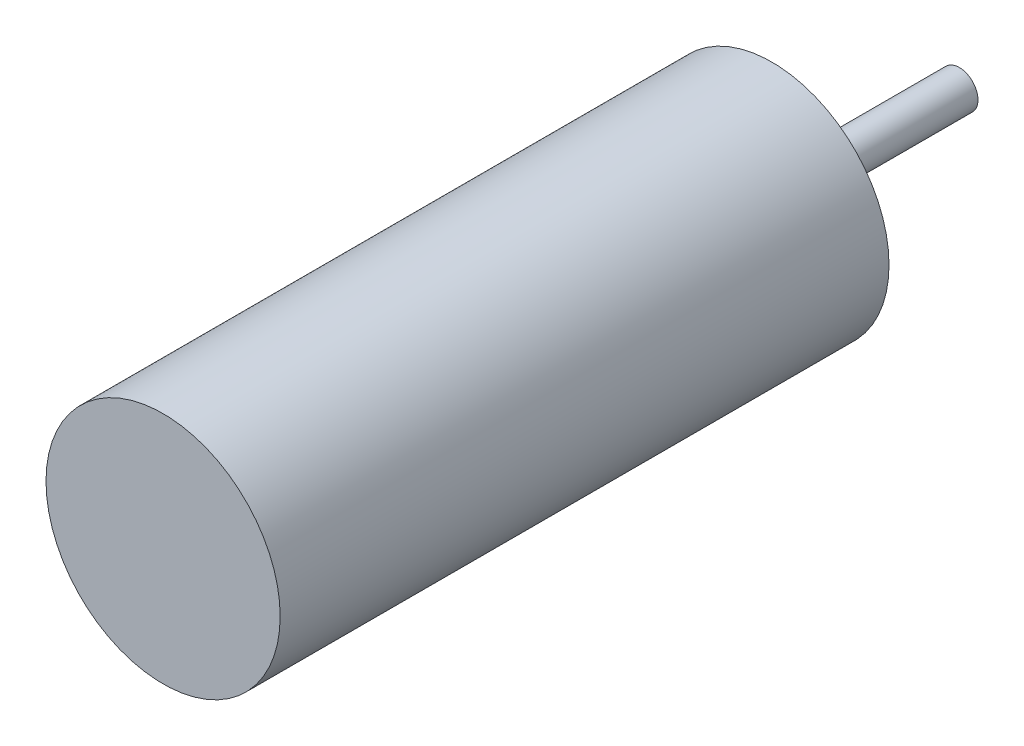
ISO-10303-21;
HEADER;
FILE_DESCRIPTION(('STEP AP214'),'2;1');
FILE_NAME('part.step','',(''),(''),'','','');
FILE_SCHEMA(('AUTOMOTIVE_DESIGN { 1 0 10303 214 1 1 1 1 }'));
ENDSEC;
DATA;
#1=APPLICATION_CONTEXT('core data for automotive mechanical design processes');
#2=APPLICATION_PROTOCOL_DEFINITION('international standard','automotive_design',2000,#1);
#3=PRODUCT_CONTEXT('',#1,'mechanical');
#4=PRODUCT('Part','Part','',(#3));
#5=PRODUCT_RELATED_PRODUCT_CATEGORY('part','',(#4));
#6=PRODUCT_DEFINITION_FORMATION('','',#4);
#7=PRODUCT_DEFINITION_CONTEXT('part definition',#1,'design');
#8=PRODUCT_DEFINITION('design','',#6,#7);
#9=PRODUCT_DEFINITION_SHAPE('','',#8);
#10=(LENGTH_UNIT() NAMED_UNIT(*) SI_UNIT(.MILLI.,.METRE.));
#11=(NAMED_UNIT(*) PLANE_ANGLE_UNIT() SI_UNIT($,.RADIAN.));
#12=(NAMED_UNIT(*) SI_UNIT($,.STERADIAN.) SOLID_ANGLE_UNIT());
#13=UNCERTAINTY_MEASURE_WITH_UNIT(LENGTH_MEASURE(1.E-05),#10,'distance_accuracy_value','');
#14=(GEOMETRIC_REPRESENTATION_CONTEXT(3) GLOBAL_UNCERTAINTY_ASSIGNED_CONTEXT((#13)) GLOBAL_UNIT_ASSIGNED_CONTEXT((#10,
#11,#12)) REPRESENTATION_CONTEXT('',''));
#15=CARTESIAN_POINT('',(0.,0.,0.));
#16=DIRECTION('',(0.,0.,1.));
#17=DIRECTION('',(1.,0.,0.));
#18=AXIS2_PLACEMENT_3D('',#15,#16,#17);
#19=CARTESIAN_POINT('',(0.,0.,20.));
#20=DIRECTION('',(0.,0.,-1.));
#21=DIRECTION('',(-1.,0.,0.));
#22=AXIS2_PLACEMENT_3D('',#19,#20,#21);
#23=CYLINDRICAL_SURFACE('',#22,2.);
#24=CARTESIAN_POINT('',(0.,0.,20.));
#25=DIRECTION('',(0.,0.,1.));
#26=DIRECTION('',(1.,0.,0.));
#27=AXIS2_PLACEMENT_3D('',#24,#25,#26);
#28=CIRCLE('',#27,2.);
#29=CARTESIAN_POINT('',(2.,0.,20.));
#30=VERTEX_POINT('',#29);
#31=EDGE_CURVE('E10',#30,#30,#28,.T.);
#32=ORIENTED_EDGE('',*,*,#31,.F.);
#33=EDGE_LOOP('',(#32));
#34=FACE_BOUND('',#33,.T.);
#35=CARTESIAN_POINT('',(0.,0.,0.));
#36=DIRECTION('',(0.,0.,1.));
#37=DIRECTION('',(1.,0.,0.));
#38=AXIS2_PLACEMENT_3D('',#35,#36,#37);
#39=CIRCLE('',#38,2.);
#40=CARTESIAN_POINT('',(2.,0.,0.));
#41=VERTEX_POINT('',#40);
#42=EDGE_CURVE('E36',#41,#41,#39,.T.);
#43=ORIENTED_EDGE('',*,*,#42,.T.);
#44=EDGE_LOOP('',(#43));
#45=FACE_BOUND('',#44,.T.);
#46=ADVANCED_FACE('F33',(#34,#45),#23,.T.);
#47=CARTESIAN_POINT('',(0.,0.,0.));
#48=DIRECTION('',(0.,0.,1.));
#49=DIRECTION('',(1.,0.,0.));
#50=AXIS2_PLACEMENT_3D('',#47,#48,#49);
#51=PLANE('',#50);
#52=ORIENTED_EDGE('',*,*,#42,.F.);
#53=EDGE_LOOP('',(#52));
#54=FACE_BOUND('',#53,.T.);
#55=ADVANCED_FACE('F61',(#54),#51,.F.);
#56=CARTESIAN_POINT('',(0.,0.,20.));
#57=DIRECTION('',(0.,0.,1.));
#58=DIRECTION('',(1.,0.,0.));
#59=AXIS2_PLACEMENT_3D('',#56,#57,#58);
#60=PLANE('',#59);
#61=CARTESIAN_POINT('',(0.,0.,20.));
#62=DIRECTION('',(0.,0.,1.));
#63=DIRECTION('',(1.,0.,0.));
#64=AXIS2_PLACEMENT_3D('',#61,#62,#63);
#65=CIRCLE('',#64,12.5);
#66=CARTESIAN_POINT('',(12.5,0.,20.));
#67=VERTEX_POINT('',#66);
#68=EDGE_CURVE('E45',#67,#67,#65,.T.);
#69=ORIENTED_EDGE('',*,*,#68,.F.);
#70=EDGE_LOOP('',(#69));
#71=FACE_BOUND('',#70,.T.);
#72=ORIENTED_EDGE('',*,*,#31,.T.);
#73=EDGE_LOOP('',(#72));
#74=FACE_BOUND('',#73,.T.);
#75=ADVANCED_FACE('F56',(#71,#74),#60,.F.);
#76=CARTESIAN_POINT('',(0.,0.,85.));
#77=DIRECTION('',(0.,0.,-1.));
#78=DIRECTION('',(-1.,0.,0.));
#79=AXIS2_PLACEMENT_3D('',#76,#77,#78);
#80=CYLINDRICAL_SURFACE('',#79,12.5);
#81=CARTESIAN_POINT('',(0.,0.,85.));
#82=DIRECTION('',(0.,0.,1.));
#83=DIRECTION('',(1.,0.,0.));
#84=AXIS2_PLACEMENT_3D('',#81,#82,#83);
#85=CIRCLE('',#84,12.5);
#86=CARTESIAN_POINT('',(12.5,0.,85.));
#87=VERTEX_POINT('',#86);
#88=EDGE_CURVE('E43',#87,#87,#85,.T.);
#89=ORIENTED_EDGE('',*,*,#88,.F.);
#90=EDGE_LOOP('',(#89));
#91=FACE_BOUND('',#90,.T.);
#92=ORIENTED_EDGE('',*,*,#68,.T.);
#93=EDGE_LOOP('',(#92));
#94=FACE_BOUND('',#93,.T.);
#95=ADVANCED_FACE('F53',(#91,#94),#80,.T.);
#96=CARTESIAN_POINT('',(0.,0.,85.));
#97=DIRECTION('',(0.,0.,1.));
#98=DIRECTION('',(1.,0.,0.));
#99=AXIS2_PLACEMENT_3D('',#96,#97,#98);
#100=PLANE('',#99);
#101=ORIENTED_EDGE('',*,*,#88,.T.);
#102=EDGE_LOOP('',(#101));
#103=FACE_BOUND('',#102,.T.);
#104=ADVANCED_FACE('F51',(#103),#100,.T.);
#105=CLOSED_SHELL('',(#46,#55,#75,#95,#104));
#106=MANIFOLD_SOLID_BREP('B2',#105);
#107=ADVANCED_BREP_SHAPE_REPRESENTATION('',(#18,#106),#14);
#108=SHAPE_DEFINITION_REPRESENTATION(#9,#107);
ENDSEC;
END-ISO-10303-21;
